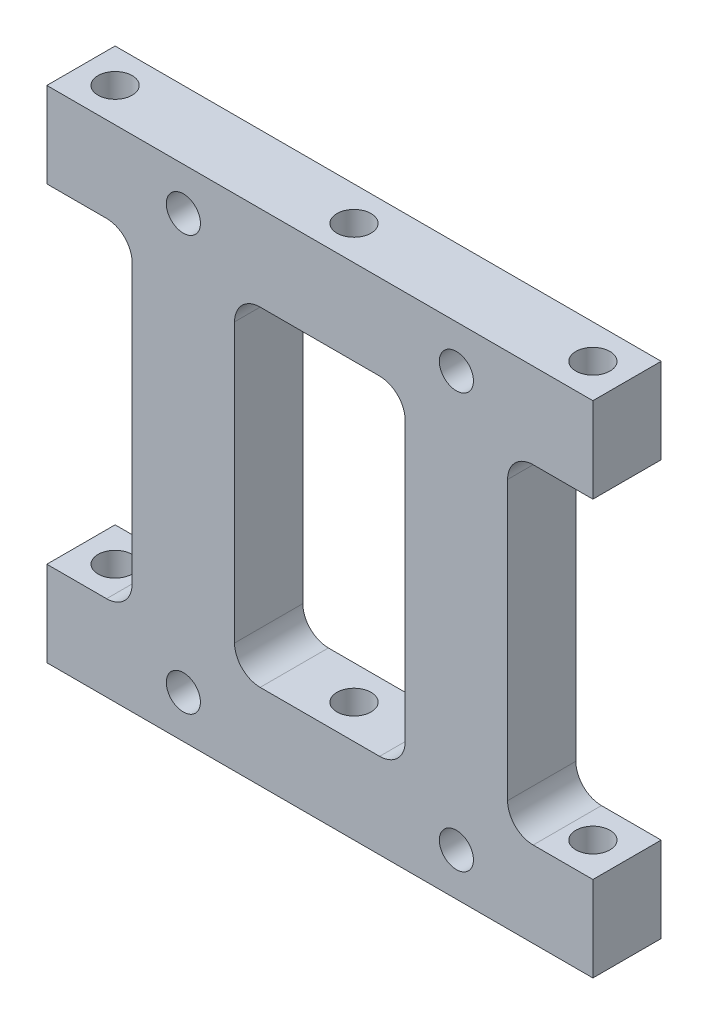
ISO-10303-21;
HEADER;
FILE_DESCRIPTION(('STEP AP214'),'2;1');
FILE_NAME('part.step','',(''),(''),'','','');
FILE_SCHEMA(('AUTOMOTIVE_DESIGN { 1 0 10303 214 1 1 1 1 }'));
ENDSEC;
DATA;
#1=APPLICATION_CONTEXT('core data for automotive mechanical design processes');
#2=APPLICATION_PROTOCOL_DEFINITION('international standard','automotive_design',2000,#1);
#3=PRODUCT_CONTEXT('',#1,'mechanical');
#4=PRODUCT('Part','Part','',(#3));
#5=PRODUCT_RELATED_PRODUCT_CATEGORY('part','',(#4));
#6=PRODUCT_DEFINITION_FORMATION('','',#4);
#7=PRODUCT_DEFINITION_CONTEXT('part definition',#1,'design');
#8=PRODUCT_DEFINITION('design','',#6,#7);
#9=PRODUCT_DEFINITION_SHAPE('','',#8);
#10=(LENGTH_UNIT() NAMED_UNIT(*) SI_UNIT(.MILLI.,.METRE.));
#11=(NAMED_UNIT(*) PLANE_ANGLE_UNIT() SI_UNIT($,.RADIAN.));
#12=(NAMED_UNIT(*) SI_UNIT($,.STERADIAN.) SOLID_ANGLE_UNIT());
#13=UNCERTAINTY_MEASURE_WITH_UNIT(LENGTH_MEASURE(1.E-05),#10,'distance_accuracy_value','');
#14=(GEOMETRIC_REPRESENTATION_CONTEXT(3) GLOBAL_UNCERTAINTY_ASSIGNED_CONTEXT((#13)) GLOBAL_UNIT_ASSIGNED_CONTEXT((#10,
#11,#12)) REPRESENTATION_CONTEXT('',''));
#15=CARTESIAN_POINT('',(0.,0.,0.));
#16=DIRECTION('',(0.,0.,1.));
#17=DIRECTION('',(1.,0.,0.));
#18=AXIS2_PLACEMENT_3D('',#15,#16,#17);
#19=CARTESIAN_POINT('',(0.,0.,8.));
#20=DIRECTION('',(1.,0.,0.));
#21=DIRECTION('',(0.,0.,-1.));
#22=AXIS2_PLACEMENT_3D('',#19,#20,#21);
#23=PLANE('',#22);
#24=DIRECTION('',(0.,-1.,0.));
#25=VECTOR('',#24,1.);
#26=CARTESIAN_POINT('',(0.,0.,0.));
#27=LINE('',#26,#25);
#28=CARTESIAN_POINT('',(0.,10.,0.));
#29=VERTEX_POINT('',#28);
#30=CARTESIAN_POINT('',(0.,0.,0.));
#31=VERTEX_POINT('',#30);
#32=EDGE_CURVE('E283',#29,#31,#27,.T.);
#33=ORIENTED_EDGE('',*,*,#32,.T.);
#34=DIRECTION('',(0.,0.,-1.));
#35=VECTOR('',#34,1.);
#36=CARTESIAN_POINT('',(0.,0.,8.));
#37=LINE('',#36,#35);
#38=CARTESIAN_POINT('',(0.,0.,8.));
#39=VERTEX_POINT('',#38);
#40=EDGE_CURVE('E338',#39,#31,#37,.T.);
#41=ORIENTED_EDGE('',*,*,#40,.F.);
#42=DIRECTION('',(0.,-1.,0.));
#43=VECTOR('',#42,1.);
#44=CARTESIAN_POINT('',(0.,0.,8.));
#45=LINE('',#44,#43);
#46=CARTESIAN_POINT('',(0.,10.,8.));
#47=VERTEX_POINT('',#46);
#48=EDGE_CURVE('E284',#47,#39,#45,.T.);
#49=ORIENTED_EDGE('',*,*,#48,.F.);
#50=DIRECTION('',(0.,0.,-1.));
#51=VECTOR('',#50,1.);
#52=CARTESIAN_POINT('',(0.,10.,8.));
#53=LINE('',#52,#51);
#54=EDGE_CURVE('E307',#47,#29,#53,.T.);
#55=ORIENTED_EDGE('',*,*,#54,.T.);
#56=EDGE_LOOP('',(#33,#41,#49,#55));
#57=FACE_BOUND('',#56,.T.);
#58=ADVANCED_FACE('F38',(#57),#23,.F.);
#59=CARTESIAN_POINT('',(0.,0.,8.));
#60=DIRECTION('',(0.,1.,0.));
#61=DIRECTION('',(0.,0.,1.));
#62=AXIS2_PLACEMENT_3D('',#59,#60,#61);
#63=PLANE('',#62);
#64=CARTESIAN_POINT('',(32.,0.,4.));
#65=DIRECTION('',(0.,-1.,0.));
#66=DIRECTION('',(0.,0.,-1.));
#67=AXIS2_PLACEMENT_3D('',#64,#65,#66);
#68=CIRCLE('',#67,2.);
#69=CARTESIAN_POINT('',(32.,0.,2.));
#70=VERTEX_POINT('',#69);
#71=EDGE_CURVE('E653',#70,#70,#68,.T.);
#72=ORIENTED_EDGE('',*,*,#71,.F.);
#73=EDGE_LOOP('',(#72));
#74=FACE_BOUND('',#73,.T.);
#75=CARTESIAN_POINT('',(60.,0.,4.));
#76=DIRECTION('',(0.,1.,0.));
#77=DIRECTION('',(0.,0.,1.));
#78=AXIS2_PLACEMENT_3D('',#75,#76,#77);
#79=CIRCLE('',#78,2.);
#80=CARTESIAN_POINT('',(60.,0.,6.));
#81=VERTEX_POINT('',#80);
#82=EDGE_CURVE('E235',#81,#81,#79,.F.);
#83=ORIENTED_EDGE('',*,*,#82,.F.);
#84=EDGE_LOOP('',(#83));
#85=FACE_BOUND('',#84,.T.);
#86=CARTESIAN_POINT('',(4.,0.,4.));
#87=DIRECTION('',(0.,1.,0.));
#88=DIRECTION('',(0.,0.,1.));
#89=AXIS2_PLACEMENT_3D('',#86,#87,#88);
#90=CIRCLE('',#89,2.);
#91=CARTESIAN_POINT('',(4.,0.,6.));
#92=VERTEX_POINT('',#91);
#93=EDGE_CURVE('E280',#92,#92,#90,.T.);
#94=ORIENTED_EDGE('',*,*,#93,.T.);
#95=EDGE_LOOP('',(#94));
#96=FACE_BOUND('',#95,.T.);
#97=DIRECTION('',(1.,0.,0.));
#98=VECTOR('',#97,1.);
#99=CARTESIAN_POINT('',(0.,0.,0.));
#100=LINE('',#99,#98);
#101=CARTESIAN_POINT('',(64.,0.,0.));
#102=VERTEX_POINT('',#101);
#103=EDGE_CURVE('E310',#31,#102,#100,.T.);
#104=ORIENTED_EDGE('',*,*,#103,.T.);
#105=DIRECTION('',(0.,0.,-1.));
#106=VECTOR('',#105,1.);
#107=CARTESIAN_POINT('',(64.,0.,8.));
#108=LINE('',#107,#106);
#109=CARTESIAN_POINT('',(64.,0.,8.));
#110=VERTEX_POINT('',#109);
#111=EDGE_CURVE('E249',#110,#102,#108,.T.);
#112=ORIENTED_EDGE('',*,*,#111,.F.);
#113=DIRECTION('',(1.,0.,0.));
#114=VECTOR('',#113,1.);
#115=CARTESIAN_POINT('',(0.,0.,8.));
#116=LINE('',#115,#114);
#117=EDGE_CURVE('E228',#39,#110,#116,.T.);
#118=ORIENTED_EDGE('',*,*,#117,.F.);
#119=ORIENTED_EDGE('',*,*,#40,.T.);
#120=EDGE_LOOP('',(#104,#112,#118,#119));
#121=FACE_BOUND('',#120,.T.);
#122=ADVANCED_FACE('F443',(#74,#85,#96,#121),#63,.F.);
#123=CARTESIAN_POINT('',(22.,10.,8.));
#124=DIRECTION('',(0.,-1.,0.));
#125=DIRECTION('',(0.,0.,-1.));
#126=AXIS2_PLACEMENT_3D('',#123,#124,#125);
#127=PLANE('',#126);
#128=CARTESIAN_POINT('',(32.,9.99999999999999,4.));
#129=DIRECTION('',(0.,-1.,0.));
#130=DIRECTION('',(0.,0.,-1.));
#131=AXIS2_PLACEMENT_3D('',#128,#129,#130);
#132=CIRCLE('',#131,2.);
#133=CARTESIAN_POINT('',(32.,9.99999999999999,2.));
#134=VERTEX_POINT('',#133);
#135=EDGE_CURVE('E621',#134,#134,#132,.T.);
#136=ORIENTED_EDGE('',*,*,#135,.T.);
#137=EDGE_LOOP('',(#136));
#138=FACE_BOUND('',#137,.T.);
#139=DIRECTION('',(-1.,0.,0.));
#140=VECTOR('',#139,1.);
#141=CARTESIAN_POINT('',(22.,10.,8.));
#142=LINE('',#141,#140);
#143=CARTESIAN_POINT('',(39.,10.,8.));
#144=VERTEX_POINT('',#143);
#145=CARTESIAN_POINT('',(25.,10.,8.));
#146=VERTEX_POINT('',#145);
#147=EDGE_CURVE('E288',#144,#146,#142,.T.);
#148=ORIENTED_EDGE('',*,*,#147,.F.);
#149=DIRECTION('',(0.,0.,-1.));
#150=VECTOR('',#149,1.);
#151=CARTESIAN_POINT('',(39.,10.,8.));
#152=LINE('',#151,#150);
#153=CARTESIAN_POINT('',(39.,10.,0.));
#154=VERTEX_POINT('',#153);
#155=EDGE_CURVE('E394',#144,#154,#152,.T.);
#156=ORIENTED_EDGE('',*,*,#155,.T.);
#157=DIRECTION('',(-1.,0.,0.));
#158=VECTOR('',#157,1.);
#159=CARTESIAN_POINT('',(22.,10.,0.));
#160=LINE('',#159,#158);
#161=CARTESIAN_POINT('',(25.,10.,0.));
#162=VERTEX_POINT('',#161);
#163=EDGE_CURVE('E312',#154,#162,#160,.T.);
#164=ORIENTED_EDGE('',*,*,#163,.T.);
#165=DIRECTION('',(0.,0.,-1.));
#166=VECTOR('',#165,1.);
#167=CARTESIAN_POINT('',(25.,10.,8.));
#168=LINE('',#167,#166);
#169=EDGE_CURVE('E356',#162,#146,#168,.F.);
#170=ORIENTED_EDGE('',*,*,#169,.T.);
#171=EDGE_LOOP('',(#148,#156,#164,#170));
#172=FACE_BOUND('',#171,.T.);
#173=ADVANCED_FACE('F446',(#138,#172),#127,.F.);
#174=CARTESIAN_POINT('',(22.,48.6,8.));
#175=DIRECTION('',(-1.,0.,0.));
#176=DIRECTION('',(0.,-1.,0.));
#177=AXIS2_PLACEMENT_3D('',#174,#175,#176);
#178=PLANE('',#177);
#179=DIRECTION('',(0.,1.,0.));
#180=VECTOR('',#179,1.);
#181=CARTESIAN_POINT('',(22.,48.6,8.));
#182=LINE('',#181,#180);
#183=CARTESIAN_POINT('',(22.,13.,8.));
#184=VERTEX_POINT('',#183);
#185=CARTESIAN_POINT('',(22.,45.6,8.));
#186=VERTEX_POINT('',#185);
#187=EDGE_CURVE('E290',#184,#186,#182,.T.);
#188=ORIENTED_EDGE('',*,*,#187,.F.);
#189=DIRECTION('',(0.,0.,-1.));
#190=VECTOR('',#189,1.);
#191=CARTESIAN_POINT('',(22.,13.,0.));
#192=LINE('',#191,#190);
#193=CARTESIAN_POINT('',(22.,13.,0.));
#194=VERTEX_POINT('',#193);
#195=EDGE_CURVE('E353',#184,#194,#192,.T.);
#196=ORIENTED_EDGE('',*,*,#195,.T.);
#197=DIRECTION('',(0.,1.,0.));
#198=VECTOR('',#197,1.);
#199=CARTESIAN_POINT('',(22.,48.6,0.));
#200=LINE('',#199,#198);
#201=CARTESIAN_POINT('',(22.,45.6,0.));
#202=VERTEX_POINT('',#201);
#203=EDGE_CURVE('E314',#194,#202,#200,.T.);
#204=ORIENTED_EDGE('',*,*,#203,.T.);
#205=DIRECTION('',(0.,0.,-1.));
#206=VECTOR('',#205,1.);
#207=CARTESIAN_POINT('',(22.,45.6,8.));
#208=LINE('',#207,#206);
#209=EDGE_CURVE('E351',#202,#186,#208,.F.);
#210=ORIENTED_EDGE('',*,*,#209,.T.);
#211=EDGE_LOOP('',(#188,#196,#204,#210));
#212=FACE_BOUND('',#211,.T.);
#213=ADVANCED_FACE('F554',(#212),#178,.F.);
#214=CARTESIAN_POINT('',(22.,48.6,8.));
#215=DIRECTION('',(0.,1.,0.));
#216=DIRECTION('',(0.,0.,1.));
#217=AXIS2_PLACEMENT_3D('',#214,#215,#216);
#218=PLANE('',#217);
#219=CARTESIAN_POINT('',(32.,48.6,4.));
#220=DIRECTION('',(0.,1.,0.));
#221=DIRECTION('',(0.,0.,1.));
#222=AXIS2_PLACEMENT_3D('',#219,#220,#221);
#223=CIRCLE('',#222,2.);
#224=CARTESIAN_POINT('',(32.,48.6,6.00000000000001));
#225=VERTEX_POINT('',#224);
#226=EDGE_CURVE('E623',#225,#225,#223,.T.);
#227=ORIENTED_EDGE('',*,*,#226,.T.);
#228=EDGE_LOOP('',(#227));
#229=FACE_BOUND('',#228,.T.);
#230=DIRECTION('',(1.,0.,0.));
#231=VECTOR('',#230,1.);
#232=CARTESIAN_POINT('',(22.,48.6,0.));
#233=LINE('',#232,#231);
#234=CARTESIAN_POINT('',(25.,48.6,0.));
#235=VERTEX_POINT('',#234);
#236=CARTESIAN_POINT('',(39.,48.6,0.));
#237=VERTEX_POINT('',#236);
#238=EDGE_CURVE('E317',#235,#237,#233,.T.);
#239=ORIENTED_EDGE('',*,*,#238,.T.);
#240=DIRECTION('',(0.,0.,-1.));
#241=VECTOR('',#240,1.);
#242=CARTESIAN_POINT('',(39.,48.6,8.));
#243=LINE('',#242,#241);
#244=CARTESIAN_POINT('',(39.,48.6,8.));
#245=VERTEX_POINT('',#244);
#246=EDGE_CURVE('E61',#237,#245,#243,.F.);
#247=ORIENTED_EDGE('',*,*,#246,.T.);
#248=DIRECTION('',(1.,0.,0.));
#249=VECTOR('',#248,1.);
#250=CARTESIAN_POINT('',(22.,48.6,8.));
#251=LINE('',#250,#249);
#252=CARTESIAN_POINT('',(25.,48.6,8.));
#253=VERTEX_POINT('',#252);
#254=EDGE_CURVE('E293',#253,#245,#251,.T.);
#255=ORIENTED_EDGE('',*,*,#254,.F.);
#256=DIRECTION('',(0.,0.,-1.));
#257=VECTOR('',#256,1.);
#258=CARTESIAN_POINT('',(25.,48.6,0.));
#259=LINE('',#258,#257);
#260=EDGE_CURVE('E359',#253,#235,#259,.T.);
#261=ORIENTED_EDGE('',*,*,#260,.T.);
#262=EDGE_LOOP('',(#239,#247,#255,#261));
#263=FACE_BOUND('',#262,.T.);
#264=ADVANCED_FACE('F559',(#229,#263),#218,.F.);
#265=CARTESIAN_POINT('',(0.,58.6,8.));
#266=DIRECTION('',(0.,-1.,0.));
#267=DIRECTION('',(0.,0.,-1.));
#268=AXIS2_PLACEMENT_3D('',#265,#266,#267);
#269=PLANE('',#268);
#270=CARTESIAN_POINT('',(32.,58.6,4.));
#271=DIRECTION('',(0.,-1.,0.));
#272=DIRECTION('',(0.,0.,-1.));
#273=AXIS2_PLACEMENT_3D('',#270,#271,#272);
#274=CIRCLE('',#273,2.);
#275=CARTESIAN_POINT('',(32.,58.6,2.));
#276=VERTEX_POINT('',#275);
#277=EDGE_CURVE('E42',#276,#276,#274,.T.);
#278=ORIENTED_EDGE('',*,*,#277,.T.);
#279=EDGE_LOOP('',(#278));
#280=FACE_BOUND('',#279,.T.);
#281=CARTESIAN_POINT('',(60.,58.6,4.));
#282=DIRECTION('',(0.,-1.,0.));
#283=DIRECTION('',(0.,0.,1.));
#284=AXIS2_PLACEMENT_3D('',#281,#282,#283);
#285=CIRCLE('',#284,2.);
#286=CARTESIAN_POINT('',(60.,58.6,6.));
#287=VERTEX_POINT('',#286);
#288=EDGE_CURVE('E420',#287,#287,#285,.T.);
#289=ORIENTED_EDGE('',*,*,#288,.T.);
#290=EDGE_LOOP('',(#289));
#291=FACE_BOUND('',#290,.T.);
#292=CARTESIAN_POINT('',(4.,58.6,4.));
#293=DIRECTION('',(0.,1.,0.));
#294=DIRECTION('',(0.,0.,1.));
#295=AXIS2_PLACEMENT_3D('',#292,#293,#294);
#296=CIRCLE('',#295,2.);
#297=CARTESIAN_POINT('',(4.,58.6,6.));
#298=VERTEX_POINT('',#297);
#299=EDGE_CURVE('E272',#298,#298,#296,.T.);
#300=ORIENTED_EDGE('',*,*,#299,.F.);
#301=EDGE_LOOP('',(#300));
#302=FACE_BOUND('',#301,.T.);
#303=DIRECTION('',(-1.,0.,0.));
#304=VECTOR('',#303,1.);
#305=CARTESIAN_POINT('',(0.,58.6,0.));
#306=LINE('',#305,#304);
#307=CARTESIAN_POINT('',(64.,58.6,0.));
#308=VERTEX_POINT('',#307);
#309=CARTESIAN_POINT('',(0.,58.6,0.));
#310=VERTEX_POINT('',#309);
#311=EDGE_CURVE('E319',#308,#310,#306,.T.);
#312=ORIENTED_EDGE('',*,*,#311,.T.);
#313=DIRECTION('',(0.,0.,-1.));
#314=VECTOR('',#313,1.);
#315=CARTESIAN_POINT('',(0.,58.6,8.));
#316=LINE('',#315,#314);
#317=CARTESIAN_POINT('',(0.,58.6,8.));
#318=VERTEX_POINT('',#317);
#319=EDGE_CURVE('E335',#318,#310,#316,.T.);
#320=ORIENTED_EDGE('',*,*,#319,.F.);
#321=DIRECTION('',(-1.,0.,0.));
#322=VECTOR('',#321,1.);
#323=CARTESIAN_POINT('',(0.,58.6,8.));
#324=LINE('',#323,#322);
#325=CARTESIAN_POINT('',(64.,58.6,8.));
#326=VERTEX_POINT('',#325);
#327=EDGE_CURVE('E295',#326,#318,#324,.T.);
#328=ORIENTED_EDGE('',*,*,#327,.F.);
#329=DIRECTION('',(0.,0.,-1.));
#330=VECTOR('',#329,1.);
#331=CARTESIAN_POINT('',(64.,58.6,8.));
#332=LINE('',#331,#330);
#333=EDGE_CURVE('E262',#326,#308,#332,.T.);
#334=ORIENTED_EDGE('',*,*,#333,.T.);
#335=EDGE_LOOP('',(#312,#320,#328,#334));
#336=FACE_BOUND('',#335,.T.);
#337=ADVANCED_FACE('F480',(#280,#291,#302,#336),#269,.F.);
#338=CARTESIAN_POINT('',(0.,58.6,8.));
#339=DIRECTION('',(1.,0.,0.));
#340=DIRECTION('',(0.,0.,-1.));
#341=AXIS2_PLACEMENT_3D('',#338,#339,#340);
#342=PLANE('',#341);
#343=DIRECTION('',(0.,-1.,0.));
#344=VECTOR('',#343,1.);
#345=CARTESIAN_POINT('',(0.,58.6,0.));
#346=LINE('',#345,#344);
#347=CARTESIAN_POINT('',(0.,48.6,0.));
#348=VERTEX_POINT('',#347);
#349=EDGE_CURVE('E321',#310,#348,#346,.T.);
#350=ORIENTED_EDGE('',*,*,#349,.T.);
#351=DIRECTION('',(0.,0.,-1.));
#352=VECTOR('',#351,1.);
#353=CARTESIAN_POINT('',(0.,48.6,8.));
#354=LINE('',#353,#352);
#355=CARTESIAN_POINT('',(0.,48.6,8.));
#356=VERTEX_POINT('',#355);
#357=EDGE_CURVE('E332',#356,#348,#354,.T.);
#358=ORIENTED_EDGE('',*,*,#357,.F.);
#359=DIRECTION('',(0.,-1.,0.));
#360=VECTOR('',#359,1.);
#361=CARTESIAN_POINT('',(0.,58.6,8.));
#362=LINE('',#361,#360);
#363=EDGE_CURVE('E297',#318,#356,#362,.T.);
#364=ORIENTED_EDGE('',*,*,#363,.F.);
#365=ORIENTED_EDGE('',*,*,#319,.T.);
#366=EDGE_LOOP('',(#350,#358,#364,#365));
#367=FACE_BOUND('',#366,.T.);
#368=ADVANCED_FACE('F483',(#367),#342,.F.);
#369=CARTESIAN_POINT('',(0.,48.6,8.));
#370=DIRECTION('',(0.,1.,0.));
#371=DIRECTION('',(0.,0.,1.));
#372=AXIS2_PLACEMENT_3D('',#369,#370,#371);
#373=PLANE('',#372);
#374=CARTESIAN_POINT('',(4.,48.6,4.));
#375=DIRECTION('',(0.,1.,0.));
#376=DIRECTION('',(0.,0.,1.));
#377=AXIS2_PLACEMENT_3D('',#374,#375,#376);
#378=CIRCLE('',#377,2.);
#379=CARTESIAN_POINT('',(4.,48.6,6.));
#380=VERTEX_POINT('',#379);
#381=EDGE_CURVE('E277',#380,#380,#378,.T.);
#382=ORIENTED_EDGE('',*,*,#381,.T.);
#383=EDGE_LOOP('',(#382));
#384=FACE_BOUND('',#383,.T.);
#385=DIRECTION('',(1.,0.,0.));
#386=VECTOR('',#385,1.);
#387=CARTESIAN_POINT('',(0.,48.6,0.));
#388=LINE('',#387,#386);
#389=CARTESIAN_POINT('',(7.,48.6,0.));
#390=VERTEX_POINT('',#389);
#391=EDGE_CURVE('E323',#348,#390,#388,.T.);
#392=ORIENTED_EDGE('',*,*,#391,.T.);
#393=DIRECTION('',(0.,0.,-1.));
#394=VECTOR('',#393,1.);
#395=CARTESIAN_POINT('',(7.,48.6,8.));
#396=LINE('',#395,#394);
#397=CARTESIAN_POINT('',(7.,48.6,8.));
#398=VERTEX_POINT('',#397);
#399=EDGE_CURVE('E346',#390,#398,#396,.F.);
#400=ORIENTED_EDGE('',*,*,#399,.T.);
#401=DIRECTION('',(1.,0.,0.));
#402=VECTOR('',#401,1.);
#403=CARTESIAN_POINT('',(0.,48.6,8.));
#404=LINE('',#403,#402);
#405=EDGE_CURVE('E299',#356,#398,#404,.T.);
#406=ORIENTED_EDGE('',*,*,#405,.F.);
#407=ORIENTED_EDGE('',*,*,#357,.T.);
#408=EDGE_LOOP('',(#392,#400,#406,#407));
#409=FACE_BOUND('',#408,.T.);
#410=ADVANCED_FACE('F487',(#384,#409),#373,.F.);
#411=CARTESIAN_POINT('',(10.,48.6,8.));
#412=DIRECTION('',(1.,0.,0.));
#413=DIRECTION('',(0.,1.,0.));
#414=AXIS2_PLACEMENT_3D('',#411,#412,#413);
#415=PLANE('',#414);
#416=DIRECTION('',(0.,-1.,0.));
#417=VECTOR('',#416,1.);
#418=CARTESIAN_POINT('',(10.,48.6,8.));
#419=LINE('',#418,#417);
#420=CARTESIAN_POINT('',(10.,45.6,8.));
#421=VERTEX_POINT('',#420);
#422=CARTESIAN_POINT('',(10.,13.,8.));
#423=VERTEX_POINT('',#422);
#424=EDGE_CURVE('E302',#421,#423,#419,.T.);
#425=ORIENTED_EDGE('',*,*,#424,.F.);
#426=DIRECTION('',(0.,0.,-1.));
#427=VECTOR('',#426,1.);
#428=CARTESIAN_POINT('',(10.,45.6,0.));
#429=LINE('',#428,#427);
#430=CARTESIAN_POINT('',(10.,45.6,0.));
#431=VERTEX_POINT('',#430);
#432=EDGE_CURVE('E343',#421,#431,#429,.T.);
#433=ORIENTED_EDGE('',*,*,#432,.T.);
#434=DIRECTION('',(0.,-1.,0.));
#435=VECTOR('',#434,1.);
#436=CARTESIAN_POINT('',(10.,48.6,0.));
#437=LINE('',#436,#435);
#438=CARTESIAN_POINT('',(10.,13.,0.));
#439=VERTEX_POINT('',#438);
#440=EDGE_CURVE('E326',#431,#439,#437,.T.);
#441=ORIENTED_EDGE('',*,*,#440,.T.);
#442=DIRECTION('',(0.,0.,-1.));
#443=VECTOR('',#442,1.);
#444=CARTESIAN_POINT('',(10.,13.,8.));
#445=LINE('',#444,#443);
#446=EDGE_CURVE('E341',#439,#423,#445,.F.);
#447=ORIENTED_EDGE('',*,*,#446,.T.);
#448=EDGE_LOOP('',(#425,#433,#441,#447));
#449=FACE_BOUND('',#448,.T.);
#450=ADVANCED_FACE('F496',(#449),#415,.F.);
#451=CARTESIAN_POINT('',(0.,10.,8.));
#452=DIRECTION('',(0.,-1.,0.));
#453=DIRECTION('',(0.,0.,-1.));
#454=AXIS2_PLACEMENT_3D('',#451,#452,#453);
#455=PLANE('',#454);
#456=CARTESIAN_POINT('',(4.,10.,4.));
#457=DIRECTION('',(0.,-1.,0.));
#458=DIRECTION('',(0.,0.,-1.));
#459=AXIS2_PLACEMENT_3D('',#456,#457,#458);
#460=CIRCLE('',#459,2.);
#461=CARTESIAN_POINT('',(4.,10.,2.));
#462=VERTEX_POINT('',#461);
#463=EDGE_CURVE('E275',#462,#462,#460,.T.);
#464=ORIENTED_EDGE('',*,*,#463,.T.);
#465=EDGE_LOOP('',(#464));
#466=FACE_BOUND('',#465,.T.);
#467=DIRECTION('',(-1.,0.,0.));
#468=VECTOR('',#467,1.);
#469=CARTESIAN_POINT('',(0.,10.,8.));
#470=LINE('',#469,#468);
#471=CARTESIAN_POINT('',(7.,10.,8.));
#472=VERTEX_POINT('',#471);
#473=EDGE_CURVE('E305',#472,#47,#470,.T.);
#474=ORIENTED_EDGE('',*,*,#473,.F.);
#475=DIRECTION('',(0.,0.,-1.));
#476=VECTOR('',#475,1.);
#477=CARTESIAN_POINT('',(7.,10.,0.));
#478=LINE('',#477,#476);
#479=CARTESIAN_POINT('',(7.,10.,0.));
#480=VERTEX_POINT('',#479);
#481=EDGE_CURVE('E348',#472,#480,#478,.T.);
#482=ORIENTED_EDGE('',*,*,#481,.T.);
#483=DIRECTION('',(-1.,0.,0.));
#484=VECTOR('',#483,1.);
#485=CARTESIAN_POINT('',(0.,10.,0.));
#486=LINE('',#485,#484);
#487=EDGE_CURVE('E286',#480,#29,#486,.T.);
#488=ORIENTED_EDGE('',*,*,#487,.T.);
#489=ORIENTED_EDGE('',*,*,#54,.F.);
#490=EDGE_LOOP('',(#474,#482,#488,#489));
#491=FACE_BOUND('',#490,.T.);
#492=ADVANCED_FACE('F505',(#466,#491),#455,.F.);
#493=CARTESIAN_POINT('',(0.,0.,8.));
#494=DIRECTION('',(0.,0.,-1.));
#495=DIRECTION('',(-1.,0.,0.));
#496=AXIS2_PLACEMENT_3D('',#493,#494,#495);
#497=PLANE('',#496);
#498=CARTESIAN_POINT('',(48.,53.6,8.));
#499=DIRECTION('',(0.,0.,-1.));
#500=DIRECTION('',(-1.,0.,0.));
#501=AXIS2_PLACEMENT_3D('',#498,#499,#500);
#502=CIRCLE('',#501,2.);
#503=CARTESIAN_POINT('',(46.,53.6,8.));
#504=VERTEX_POINT('',#503);
#505=EDGE_CURVE('E424',#504,#504,#502,.T.);
#506=ORIENTED_EDGE('',*,*,#505,.T.);
#507=EDGE_LOOP('',(#506));
#508=FACE_BOUND('',#507,.T.);
#509=CARTESIAN_POINT('',(48.,5.,8.));
#510=DIRECTION('',(0.,0.,-1.));
#511=DIRECTION('',(1.,0.,0.));
#512=AXIS2_PLACEMENT_3D('',#509,#510,#511);
#513=CIRCLE('',#512,2.);
#514=CARTESIAN_POINT('',(50.,5.,8.));
#515=VERTEX_POINT('',#514);
#516=EDGE_CURVE('E433',#515,#515,#513,.T.);
#517=ORIENTED_EDGE('',*,*,#516,.T.);
#518=EDGE_LOOP('',(#517));
#519=FACE_BOUND('',#518,.T.);
#520=DIRECTION('',(0.,-1.,0.));
#521=VECTOR('',#520,1.);
#522=CARTESIAN_POINT('',(64.,58.6,8.));
#523=LINE('',#522,#521);
#524=CARTESIAN_POINT('',(64.,48.6,8.));
#525=VERTEX_POINT('',#524);
#526=EDGE_CURVE('E243',#326,#525,#523,.T.);
#527=ORIENTED_EDGE('',*,*,#526,.F.);
#528=ORIENTED_EDGE('',*,*,#327,.T.);
#529=ORIENTED_EDGE('',*,*,#363,.T.);
#530=ORIENTED_EDGE('',*,*,#405,.T.);
#531=CARTESIAN_POINT('',(7.,45.6,8.));
#532=DIRECTION('',(0.,0.,-1.));
#533=DIRECTION('',(-1.,0.,0.));
#534=AXIS2_PLACEMENT_3D('',#531,#532,#533);
#535=CIRCLE('',#534,3.);
#536=EDGE_CURVE('E364',#398,#421,#535,.T.);
#537=ORIENTED_EDGE('',*,*,#536,.T.);
#538=ORIENTED_EDGE('',*,*,#424,.T.);
#539=CARTESIAN_POINT('',(7.,13.,8.));
#540=DIRECTION('',(0.,0.,-1.));
#541=DIRECTION('',(-1.,0.,0.));
#542=AXIS2_PLACEMENT_3D('',#539,#540,#541);
#543=CIRCLE('',#542,3.);
#544=EDGE_CURVE('E368',#423,#472,#543,.T.);
#545=ORIENTED_EDGE('',*,*,#544,.T.);
#546=ORIENTED_EDGE('',*,*,#473,.T.);
#547=ORIENTED_EDGE('',*,*,#48,.T.);
#548=ORIENTED_EDGE('',*,*,#117,.T.);
#549=DIRECTION('',(0.,-1.,0.));
#550=VECTOR('',#549,1.);
#551=CARTESIAN_POINT('',(64.,0.,8.));
#552=LINE('',#551,#550);
#553=CARTESIAN_POINT('',(64.,10.,8.));
#554=VERTEX_POINT('',#553);
#555=EDGE_CURVE('E213',#554,#110,#552,.T.);
#556=ORIENTED_EDGE('',*,*,#555,.F.);
#557=DIRECTION('',(1.,0.,0.));
#558=VECTOR('',#557,1.);
#559=CARTESIAN_POINT('',(64.,10.,8.));
#560=LINE('',#559,#558);
#561=CARTESIAN_POINT('',(57.,10.,8.));
#562=VERTEX_POINT('',#561);
#563=EDGE_CURVE('E201',#562,#554,#560,.T.);
#564=ORIENTED_EDGE('',*,*,#563,.F.);
#565=CARTESIAN_POINT('',(57.,13.,8.));
#566=DIRECTION('',(0.,0.,-1.));
#567=DIRECTION('',(-1.,0.,0.));
#568=AXIS2_PLACEMENT_3D('',#565,#566,#567);
#569=CIRCLE('',#568,3.);
#570=CARTESIAN_POINT('',(54.,13.,8.));
#571=VERTEX_POINT('',#570);
#572=EDGE_CURVE('E409',#562,#571,#569,.T.);
#573=ORIENTED_EDGE('',*,*,#572,.T.);
#574=DIRECTION('',(0.,-1.,0.));
#575=VECTOR('',#574,1.);
#576=CARTESIAN_POINT('',(54.,48.6,8.));
#577=LINE('',#576,#575);
#578=CARTESIAN_POINT('',(54.,45.6,8.));
#579=VERTEX_POINT('',#578);
#580=EDGE_CURVE('E212',#579,#571,#577,.T.);
#581=ORIENTED_EDGE('',*,*,#580,.F.);
#582=CARTESIAN_POINT('',(57.,45.6,8.));
#583=DIRECTION('',(0.,0.,-1.));
#584=DIRECTION('',(-1.,0.,0.));
#585=AXIS2_PLACEMENT_3D('',#582,#583,#584);
#586=CIRCLE('',#585,3.);
#587=CARTESIAN_POINT('',(57.,48.6,8.));
#588=VERTEX_POINT('',#587);
#589=EDGE_CURVE('E405',#579,#588,#586,.T.);
#590=ORIENTED_EDGE('',*,*,#589,.T.);
#591=DIRECTION('',(-1.,0.,0.));
#592=VECTOR('',#591,1.);
#593=CARTESIAN_POINT('',(64.,48.6,8.));
#594=LINE('',#593,#592);
#595=EDGE_CURVE('E240',#525,#588,#594,.T.);
#596=ORIENTED_EDGE('',*,*,#595,.F.);
#597=EDGE_LOOP('',(#527,#528,#529,#530,#537,#538,#545,#546,#547,#548,#556,#564,#573,#581,#590,#596));
#598=FACE_BOUND('',#597,.T.);
#599=CARTESIAN_POINT('',(16.,53.6,8.));
#600=DIRECTION('',(0.,0.,1.));
#601=DIRECTION('',(1.,0.,0.));
#602=AXIS2_PLACEMENT_3D('',#599,#600,#601);
#603=CIRCLE('',#602,2.);
#604=CARTESIAN_POINT('',(18.,53.6,8.));
#605=VERTEX_POINT('',#604);
#606=EDGE_CURVE('E266',#605,#605,#603,.T.);
#607=ORIENTED_EDGE('',*,*,#606,.F.);
#608=EDGE_LOOP('',(#607));
#609=FACE_BOUND('',#608,.T.);
#610=CARTESIAN_POINT('',(16.,5.,8.));
#611=DIRECTION('',(0.,0.,1.));
#612=DIRECTION('',(-1.,0.,0.));
#613=AXIS2_PLACEMENT_3D('',#610,#611,#612);
#614=CIRCLE('',#613,2.);
#615=CARTESIAN_POINT('',(14.,5.,8.));
#616=VERTEX_POINT('',#615);
#617=EDGE_CURVE('E221',#616,#616,#614,.T.);
#618=ORIENTED_EDGE('',*,*,#617,.F.);
#619=EDGE_LOOP('',(#618));
#620=FACE_BOUND('',#619,.T.);
#621=ORIENTED_EDGE('',*,*,#254,.T.);
#622=CARTESIAN_POINT('',(39.,45.6,8.));
#623=DIRECTION('',(0.,0.,-1.));
#624=DIRECTION('',(-1.,0.,0.));
#625=AXIS2_PLACEMENT_3D('',#622,#623,#624);
#626=CIRCLE('',#625,3.);
#627=CARTESIAN_POINT('',(42.,45.6,8.));
#628=VERTEX_POINT('',#627);
#629=EDGE_CURVE('E11',#245,#628,#626,.T.);
#630=ORIENTED_EDGE('',*,*,#629,.T.);
#631=DIRECTION('',(0.,1.,0.));
#632=VECTOR('',#631,1.);
#633=CARTESIAN_POINT('',(42.,48.6,8.));
#634=LINE('',#633,#632);
#635=CARTESIAN_POINT('',(42.,13.,8.));
#636=VERTEX_POINT('',#635);
#637=EDGE_CURVE('E246',#636,#628,#634,.T.);
#638=ORIENTED_EDGE('',*,*,#637,.F.);
#639=CARTESIAN_POINT('',(39.,13.,8.));
#640=DIRECTION('',(0.,0.,-1.));
#641=DIRECTION('',(-1.,0.,0.));
#642=AXIS2_PLACEMENT_3D('',#639,#640,#641);
#643=CIRCLE('',#642,3.);
#644=EDGE_CURVE('E413',#636,#144,#643,.T.);
#645=ORIENTED_EDGE('',*,*,#644,.T.);
#646=ORIENTED_EDGE('',*,*,#147,.T.);
#647=CARTESIAN_POINT('',(25.,13.,8.));
#648=DIRECTION('',(0.,0.,-1.));
#649=DIRECTION('',(-1.,0.,0.));
#650=AXIS2_PLACEMENT_3D('',#647,#648,#649);
#651=CIRCLE('',#650,3.);
#652=EDGE_CURVE('E373',#146,#184,#651,.T.);
#653=ORIENTED_EDGE('',*,*,#652,.T.);
#654=ORIENTED_EDGE('',*,*,#187,.T.);
#655=CARTESIAN_POINT('',(25.,45.6,8.));
#656=DIRECTION('',(0.,0.,-1.));
#657=DIRECTION('',(-1.,0.,0.));
#658=AXIS2_PLACEMENT_3D('',#655,#656,#657);
#659=CIRCLE('',#658,3.);
#660=EDGE_CURVE('E377',#186,#253,#659,.T.);
#661=ORIENTED_EDGE('',*,*,#660,.T.);
#662=EDGE_LOOP('',(#621,#630,#638,#645,#646,#653,#654,#661));
#663=FACE_BOUND('',#662,.T.);
#664=ADVANCED_FACE('F225',(#508,#519,#598,#609,#620,#663),#497,.F.);
#665=CARTESIAN_POINT('',(0.,0.,0.));
#666=DIRECTION('',(0.,0.,-1.));
#667=DIRECTION('',(-1.,0.,0.));
#668=AXIS2_PLACEMENT_3D('',#665,#666,#667);
#669=PLANE('',#668);
#670=CARTESIAN_POINT('',(48.,53.6,0.));
#671=DIRECTION('',(0.,0.,-1.));
#672=DIRECTION('',(-1.,0.,0.));
#673=AXIS2_PLACEMENT_3D('',#670,#671,#672);
#674=CIRCLE('',#673,2.);
#675=CARTESIAN_POINT('',(46.,53.6,0.));
#676=VERTEX_POINT('',#675);
#677=EDGE_CURVE('E423',#676,#676,#674,.F.);
#678=ORIENTED_EDGE('',*,*,#677,.T.);
#679=EDGE_LOOP('',(#678));
#680=FACE_BOUND('',#679,.T.);
#681=CARTESIAN_POINT('',(48.,5.,0.));
#682=DIRECTION('',(0.,0.,-1.));
#683=DIRECTION('',(-1.,0.,0.));
#684=AXIS2_PLACEMENT_3D('',#681,#682,#683);
#685=CIRCLE('',#684,2.);
#686=CARTESIAN_POINT('',(46.,5.,0.));
#687=VERTEX_POINT('',#686);
#688=EDGE_CURVE('E421',#687,#687,#685,.F.);
#689=ORIENTED_EDGE('',*,*,#688,.T.);
#690=EDGE_LOOP('',(#689));
#691=FACE_BOUND('',#690,.T.);
#692=ORIENTED_EDGE('',*,*,#311,.F.);
#693=DIRECTION('',(0.,-1.,0.));
#694=VECTOR('',#693,1.);
#695=CARTESIAN_POINT('',(64.,58.6,0.));
#696=LINE('',#695,#694);
#697=CARTESIAN_POINT('',(64.,48.6,0.));
#698=VERTEX_POINT('',#697);
#699=EDGE_CURVE('E232',#308,#698,#696,.T.);
#700=ORIENTED_EDGE('',*,*,#699,.T.);
#701=DIRECTION('',(-1.,0.,0.));
#702=VECTOR('',#701,1.);
#703=CARTESIAN_POINT('',(64.,48.6,0.));
#704=LINE('',#703,#702);
#705=CARTESIAN_POINT('',(57.,48.6,0.));
#706=VERTEX_POINT('',#705);
#707=EDGE_CURVE('E256',#698,#706,#704,.T.);
#708=ORIENTED_EDGE('',*,*,#707,.T.);
#709=CARTESIAN_POINT('',(57.,45.6,0.));
#710=DIRECTION('',(0.,0.,-1.));
#711=DIRECTION('',(-1.,0.,0.));
#712=AXIS2_PLACEMENT_3D('',#709,#710,#711);
#713=CIRCLE('',#712,3.);
#714=CARTESIAN_POINT('',(54.,45.6,0.));
#715=VERTEX_POINT('',#714);
#716=EDGE_CURVE('E403',#706,#715,#713,.F.);
#717=ORIENTED_EDGE('',*,*,#716,.T.);
#718=DIRECTION('',(0.,-1.,0.));
#719=VECTOR('',#718,1.);
#720=CARTESIAN_POINT('',(54.,48.6,0.));
#721=LINE('',#720,#719);
#722=CARTESIAN_POINT('',(54.,13.,0.));
#723=VERTEX_POINT('',#722);
#724=EDGE_CURVE('E253',#715,#723,#721,.T.);
#725=ORIENTED_EDGE('',*,*,#724,.T.);
#726=CARTESIAN_POINT('',(57.,13.,0.));
#727=DIRECTION('',(0.,0.,-1.));
#728=DIRECTION('',(-1.,0.,0.));
#729=AXIS2_PLACEMENT_3D('',#726,#727,#728);
#730=CIRCLE('',#729,3.);
#731=CARTESIAN_POINT('',(57.,10.,0.));
#732=VERTEX_POINT('',#731);
#733=EDGE_CURVE('E407',#723,#732,#730,.F.);
#734=ORIENTED_EDGE('',*,*,#733,.T.);
#735=DIRECTION('',(1.,0.,0.));
#736=VECTOR('',#735,1.);
#737=CARTESIAN_POINT('',(64.,10.,0.));
#738=LINE('',#737,#736);
#739=CARTESIAN_POINT('',(64.,10.,0.));
#740=VERTEX_POINT('',#739);
#741=EDGE_CURVE('E251',#732,#740,#738,.T.);
#742=ORIENTED_EDGE('',*,*,#741,.T.);
#743=DIRECTION('',(0.,-1.,0.));
#744=VECTOR('',#743,1.);
#745=CARTESIAN_POINT('',(64.,0.,0.));
#746=LINE('',#745,#744);
#747=EDGE_CURVE('E220',#740,#102,#746,.T.);
#748=ORIENTED_EDGE('',*,*,#747,.T.);
#749=ORIENTED_EDGE('',*,*,#103,.F.);
#750=ORIENTED_EDGE('',*,*,#32,.F.);
#751=ORIENTED_EDGE('',*,*,#487,.F.);
#752=CARTESIAN_POINT('',(7.,13.,0.));
#753=DIRECTION('',(0.,0.,-1.));
#754=DIRECTION('',(-1.,0.,0.));
#755=AXIS2_PLACEMENT_3D('',#752,#753,#754);
#756=CIRCLE('',#755,3.);
#757=EDGE_CURVE('E366',#480,#439,#756,.F.);
#758=ORIENTED_EDGE('',*,*,#757,.T.);
#759=ORIENTED_EDGE('',*,*,#440,.F.);
#760=CARTESIAN_POINT('',(7.,45.6,0.));
#761=DIRECTION('',(0.,0.,-1.));
#762=DIRECTION('',(-1.,0.,0.));
#763=AXIS2_PLACEMENT_3D('',#760,#761,#762);
#764=CIRCLE('',#763,3.);
#765=EDGE_CURVE('E362',#431,#390,#764,.F.);
#766=ORIENTED_EDGE('',*,*,#765,.T.);
#767=ORIENTED_EDGE('',*,*,#391,.F.);
#768=ORIENTED_EDGE('',*,*,#349,.F.);
#769=EDGE_LOOP('',(#692,#700,#708,#717,#725,#734,#742,#748,#749,#750,#751,#758,#759,#766,#767,#768));
#770=FACE_BOUND('',#769,.T.);
#771=CARTESIAN_POINT('',(16.,53.6,0.));
#772=DIRECTION('',(0.,0.,-1.));
#773=DIRECTION('',(-1.,0.,0.));
#774=AXIS2_PLACEMENT_3D('',#771,#772,#773);
#775=CIRCLE('',#774,2.);
#776=CARTESIAN_POINT('',(14.,53.6,0.));
#777=VERTEX_POINT('',#776);
#778=EDGE_CURVE('E276',#777,#777,#775,.T.);
#779=ORIENTED_EDGE('',*,*,#778,.F.);
#780=EDGE_LOOP('',(#779));
#781=FACE_BOUND('',#780,.T.);
#782=CARTESIAN_POINT('',(16.,5.,0.));
#783=DIRECTION('',(0.,0.,-1.));
#784=DIRECTION('',(-1.,0.,0.));
#785=AXIS2_PLACEMENT_3D('',#782,#783,#784);
#786=CIRCLE('',#785,2.);
#787=CARTESIAN_POINT('',(14.,5.,0.));
#788=VERTEX_POINT('',#787);
#789=EDGE_CURVE('E269',#788,#788,#786,.T.);
#790=ORIENTED_EDGE('',*,*,#789,.F.);
#791=EDGE_LOOP('',(#790));
#792=FACE_BOUND('',#791,.T.);
#793=ORIENTED_EDGE('',*,*,#163,.F.);
#794=CARTESIAN_POINT('',(39.,13.,0.));
#795=DIRECTION('',(0.,0.,-1.));
#796=DIRECTION('',(-1.,0.,0.));
#797=AXIS2_PLACEMENT_3D('',#794,#795,#796);
#798=CIRCLE('',#797,3.);
#799=CARTESIAN_POINT('',(42.,13.,0.));
#800=VERTEX_POINT('',#799);
#801=EDGE_CURVE('E411',#154,#800,#798,.F.);
#802=ORIENTED_EDGE('',*,*,#801,.T.);
#803=DIRECTION('',(0.,1.,0.));
#804=VECTOR('',#803,1.);
#805=CARTESIAN_POINT('',(42.,48.6,0.));
#806=LINE('',#805,#804);
#807=CARTESIAN_POINT('',(42.,45.6,0.));
#808=VERTEX_POINT('',#807);
#809=EDGE_CURVE('E230',#800,#808,#806,.T.);
#810=ORIENTED_EDGE('',*,*,#809,.T.);
#811=CARTESIAN_POINT('',(39.,45.6,0.));
#812=DIRECTION('',(0.,0.,-1.));
#813=DIRECTION('',(-1.,0.,0.));
#814=AXIS2_PLACEMENT_3D('',#811,#812,#813);
#815=CIRCLE('',#814,3.);
#816=EDGE_CURVE('E47',#808,#237,#815,.F.);
#817=ORIENTED_EDGE('',*,*,#816,.T.);
#818=ORIENTED_EDGE('',*,*,#238,.F.);
#819=CARTESIAN_POINT('',(25.,45.6,0.));
#820=DIRECTION('',(0.,0.,-1.));
#821=DIRECTION('',(-1.,0.,0.));
#822=AXIS2_PLACEMENT_3D('',#819,#820,#821);
#823=CIRCLE('',#822,3.);
#824=EDGE_CURVE('E375',#235,#202,#823,.F.);
#825=ORIENTED_EDGE('',*,*,#824,.T.);
#826=ORIENTED_EDGE('',*,*,#203,.F.);
#827=CARTESIAN_POINT('',(25.,13.,0.));
#828=DIRECTION('',(0.,0.,-1.));
#829=DIRECTION('',(-1.,0.,0.));
#830=AXIS2_PLACEMENT_3D('',#827,#828,#829);
#831=CIRCLE('',#830,3.);
#832=EDGE_CURVE('E370',#194,#162,#831,.F.);
#833=ORIENTED_EDGE('',*,*,#832,.T.);
#834=EDGE_LOOP('',(#793,#802,#810,#817,#818,#825,#826,#833));
#835=FACE_BOUND('',#834,.T.);
#836=ADVANCED_FACE('F454',(#680,#691,#770,#781,#792,#835),#669,.T.);
#837=CARTESIAN_POINT('',(7.,45.6,8.));
#838=DIRECTION('',(0.,0.,1.));
#839=DIRECTION('',(1.,0.,0.));
#840=AXIS2_PLACEMENT_3D('',#837,#838,#839);
#841=CYLINDRICAL_SURFACE('',#840,3.);
#842=ORIENTED_EDGE('',*,*,#536,.F.);
#843=ORIENTED_EDGE('',*,*,#399,.F.);
#844=ORIENTED_EDGE('',*,*,#765,.F.);
#845=ORIENTED_EDGE('',*,*,#432,.F.);
#846=EDGE_LOOP('',(#842,#843,#844,#845));
#847=FACE_BOUND('',#846,.T.);
#848=ADVANCED_FACE('F493',(#847),#841,.F.);
#849=CARTESIAN_POINT('',(7.,13.,8.));
#850=DIRECTION('',(0.,0.,1.));
#851=DIRECTION('',(1.,0.,0.));
#852=AXIS2_PLACEMENT_3D('',#849,#850,#851);
#853=CYLINDRICAL_SURFACE('',#852,3.);
#854=ORIENTED_EDGE('',*,*,#544,.F.);
#855=ORIENTED_EDGE('',*,*,#446,.F.);
#856=ORIENTED_EDGE('',*,*,#757,.F.);
#857=ORIENTED_EDGE('',*,*,#481,.F.);
#858=EDGE_LOOP('',(#854,#855,#856,#857));
#859=FACE_BOUND('',#858,.T.);
#860=ADVANCED_FACE('F502',(#859),#853,.F.);
#861=CARTESIAN_POINT('',(25.,13.,8.));
#862=DIRECTION('',(0.,0.,1.));
#863=DIRECTION('',(1.,0.,0.));
#864=AXIS2_PLACEMENT_3D('',#861,#862,#863);
#865=CYLINDRICAL_SURFACE('',#864,3.);
#866=ORIENTED_EDGE('',*,*,#652,.F.);
#867=ORIENTED_EDGE('',*,*,#169,.F.);
#868=ORIENTED_EDGE('',*,*,#832,.F.);
#869=ORIENTED_EDGE('',*,*,#195,.F.);
#870=EDGE_LOOP('',(#866,#867,#868,#869));
#871=FACE_BOUND('',#870,.T.);
#872=ADVANCED_FACE('F519',(#871),#865,.F.);
#873=CARTESIAN_POINT('',(25.,45.6,8.));
#874=DIRECTION('',(0.,0.,1.));
#875=DIRECTION('',(1.,0.,0.));
#876=AXIS2_PLACEMENT_3D('',#873,#874,#875);
#877=CYLINDRICAL_SURFACE('',#876,3.);
#878=ORIENTED_EDGE('',*,*,#660,.F.);
#879=ORIENTED_EDGE('',*,*,#209,.F.);
#880=ORIENTED_EDGE('',*,*,#824,.F.);
#881=ORIENTED_EDGE('',*,*,#260,.F.);
#882=EDGE_LOOP('',(#878,#879,#880,#881));
#883=FACE_BOUND('',#882,.T.);
#884=ADVANCED_FACE('F522',(#883),#877,.F.);
#885=CARTESIAN_POINT('',(4.,-1.4,4.));
#886=DIRECTION('',(0.,1.,0.));
#887=DIRECTION('',(0.,0.,1.));
#888=AXIS2_PLACEMENT_3D('',#885,#886,#887);
#889=CYLINDRICAL_SURFACE('',#888,2.);
#890=ORIENTED_EDGE('',*,*,#463,.F.);
#891=EDGE_LOOP('',(#890));
#892=FACE_BOUND('',#891,.T.);
#893=ORIENTED_EDGE('',*,*,#93,.F.);
#894=EDGE_LOOP('',(#893));
#895=FACE_BOUND('',#894,.T.);
#896=ADVANCED_FACE('F526',(#892,#895),#889,.F.);
#897=ORIENTED_EDGE('',*,*,#299,.T.);
#898=EDGE_LOOP('',(#897));
#899=FACE_BOUND('',#898,.T.);
#900=ORIENTED_EDGE('',*,*,#381,.F.);
#901=EDGE_LOOP('',(#900));
#902=FACE_BOUND('',#901,.T.);
#903=ADVANCED_FACE('F588',(#899,#902),#889,.F.);
#904=CARTESIAN_POINT('',(16.,5.,-42.));
#905=DIRECTION('',(0.,0.,1.));
#906=DIRECTION('',(1.,0.,0.));
#907=AXIS2_PLACEMENT_3D('',#904,#905,#906);
#908=CYLINDRICAL_SURFACE('',#907,2.);
#909=ORIENTED_EDGE('',*,*,#789,.T.);
#910=EDGE_LOOP('',(#909));
#911=FACE_BOUND('',#910,.T.);
#912=ORIENTED_EDGE('',*,*,#617,.T.);
#913=EDGE_LOOP('',(#912));
#914=FACE_BOUND('',#913,.T.);
#915=ADVANCED_FACE('F584',(#911,#914),#908,.F.);
#916=CARTESIAN_POINT('',(16.,53.6,-42.));
#917=DIRECTION('',(0.,0.,1.));
#918=DIRECTION('',(1.,0.,0.));
#919=AXIS2_PLACEMENT_3D('',#916,#917,#918);
#920=CYLINDRICAL_SURFACE('',#919,2.);
#921=ORIENTED_EDGE('',*,*,#778,.T.);
#922=EDGE_LOOP('',(#921));
#923=FACE_BOUND('',#922,.T.);
#924=ORIENTED_EDGE('',*,*,#606,.T.);
#925=EDGE_LOOP('',(#924));
#926=FACE_BOUND('',#925,.T.);
#927=ADVANCED_FACE('F581',(#923,#926),#920,.F.);
#928=CARTESIAN_POINT('',(64.,0.,8.));
#929=DIRECTION('',(1.,0.,0.));
#930=DIRECTION('',(0.,0.,-1.));
#931=AXIS2_PLACEMENT_3D('',#928,#929,#930);
#932=PLANE('',#931);
#933=ORIENTED_EDGE('',*,*,#747,.F.);
#934=DIRECTION('',(0.,0.,-1.));
#935=VECTOR('',#934,1.);
#936=CARTESIAN_POINT('',(64.,10.,8.));
#937=LINE('',#936,#935);
#938=EDGE_CURVE('E205',#554,#740,#937,.T.);
#939=ORIENTED_EDGE('',*,*,#938,.F.);
#940=ORIENTED_EDGE('',*,*,#555,.T.);
#941=ORIENTED_EDGE('',*,*,#111,.T.);
#942=EDGE_LOOP('',(#933,#939,#940,#941));
#943=FACE_BOUND('',#942,.T.);
#944=ADVANCED_FACE('F217',(#943),#932,.T.);
#945=CARTESIAN_POINT('',(64.,10.,8.));
#946=DIRECTION('',(0.,1.,0.));
#947=DIRECTION('',(0.,0.,1.));
#948=AXIS2_PLACEMENT_3D('',#945,#946,#947);
#949=PLANE('',#948);
#950=CARTESIAN_POINT('',(60.,10.,4.));
#951=DIRECTION('',(0.,1.,0.));
#952=DIRECTION('',(0.,0.,1.));
#953=AXIS2_PLACEMENT_3D('',#950,#951,#952);
#954=CIRCLE('',#953,2.);
#955=CARTESIAN_POINT('',(60.,10.,6.));
#956=VERTEX_POINT('',#955);
#957=EDGE_CURVE('E419',#956,#956,#954,.F.);
#958=ORIENTED_EDGE('',*,*,#957,.T.);
#959=EDGE_LOOP('',(#958));
#960=FACE_BOUND('',#959,.T.);
#961=ORIENTED_EDGE('',*,*,#741,.F.);
#962=DIRECTION('',(0.,0.,-1.));
#963=VECTOR('',#962,1.);
#964=CARTESIAN_POINT('',(57.,10.,8.));
#965=LINE('',#964,#963);
#966=EDGE_CURVE('E208',#732,#562,#965,.F.);
#967=ORIENTED_EDGE('',*,*,#966,.T.);
#968=ORIENTED_EDGE('',*,*,#563,.T.);
#969=ORIENTED_EDGE('',*,*,#938,.T.);
#970=EDGE_LOOP('',(#961,#967,#968,#969));
#971=FACE_BOUND('',#970,.T.);
#972=ADVANCED_FACE('F204',(#960,#971),#949,.T.);
#973=CARTESIAN_POINT('',(54.,48.6,8.));
#974=DIRECTION('',(1.,0.,0.));
#975=DIRECTION('',(0.,1.,0.));
#976=AXIS2_PLACEMENT_3D('',#973,#974,#975);
#977=PLANE('',#976);
#978=ORIENTED_EDGE('',*,*,#724,.F.);
#979=DIRECTION('',(0.,0.,-1.));
#980=VECTOR('',#979,1.);
#981=CARTESIAN_POINT('',(54.,45.6,8.));
#982=LINE('',#981,#980);
#983=EDGE_CURVE('E391',#715,#579,#982,.F.);
#984=ORIENTED_EDGE('',*,*,#983,.T.);
#985=ORIENTED_EDGE('',*,*,#580,.T.);
#986=DIRECTION('',(0.,0.,-1.));
#987=VECTOR('',#986,1.);
#988=CARTESIAN_POINT('',(54.,13.,0.));
#989=LINE('',#988,#987);
#990=EDGE_CURVE('E388',#571,#723,#989,.T.);
#991=ORIENTED_EDGE('',*,*,#990,.T.);
#992=EDGE_LOOP('',(#978,#984,#985,#991));
#993=FACE_BOUND('',#992,.T.);
#994=ADVANCED_FACE('F463',(#993),#977,.T.);
#995=CARTESIAN_POINT('',(64.,48.6,8.));
#996=DIRECTION('',(0.,-1.,0.));
#997=DIRECTION('',(0.,0.,-1.));
#998=AXIS2_PLACEMENT_3D('',#995,#996,#997);
#999=PLANE('',#998);
#1000=CARTESIAN_POINT('',(60.,48.6,4.));
#1001=DIRECTION('',(0.,-1.,0.));
#1002=DIRECTION('',(0.,0.,-1.));
#1003=AXIS2_PLACEMENT_3D('',#1000,#1001,#1002);
#1004=CIRCLE('',#1003,2.);
#1005=CARTESIAN_POINT('',(60.,48.6,2.));
#1006=VERTEX_POINT('',#1005);
#1007=EDGE_CURVE('E416',#1006,#1006,#1004,.F.);
#1008=ORIENTED_EDGE('',*,*,#1007,.T.);
#1009=EDGE_LOOP('',(#1008));
#1010=FACE_BOUND('',#1009,.T.);
#1011=ORIENTED_EDGE('',*,*,#595,.T.);
#1012=DIRECTION('',(0.,0.,-1.));
#1013=VECTOR('',#1012,1.);
#1014=CARTESIAN_POINT('',(57.,48.6,0.));
#1015=LINE('',#1014,#1013);
#1016=EDGE_CURVE('E379',#588,#706,#1015,.T.);
#1017=ORIENTED_EDGE('',*,*,#1016,.T.);
#1018=ORIENTED_EDGE('',*,*,#707,.F.);
#1019=DIRECTION('',(0.,0.,-1.));
#1020=VECTOR('',#1019,1.);
#1021=CARTESIAN_POINT('',(64.,48.6,8.));
#1022=LINE('',#1021,#1020);
#1023=EDGE_CURVE('E222',#525,#698,#1022,.T.);
#1024=ORIENTED_EDGE('',*,*,#1023,.F.);
#1025=EDGE_LOOP('',(#1011,#1017,#1018,#1024));
#1026=FACE_BOUND('',#1025,.T.);
#1027=ADVANCED_FACE('F470',(#1010,#1026),#999,.T.);
#1028=CARTESIAN_POINT('',(64.,58.6,8.));
#1029=DIRECTION('',(1.,0.,0.));
#1030=DIRECTION('',(0.,0.,-1.));
#1031=AXIS2_PLACEMENT_3D('',#1028,#1029,#1030);
#1032=PLANE('',#1031);
#1033=ORIENTED_EDGE('',*,*,#699,.F.);
#1034=ORIENTED_EDGE('',*,*,#333,.F.);
#1035=ORIENTED_EDGE('',*,*,#526,.T.);
#1036=ORIENTED_EDGE('',*,*,#1023,.T.);
#1037=EDGE_LOOP('',(#1033,#1034,#1035,#1036));
#1038=FACE_BOUND('',#1037,.T.);
#1039=ADVANCED_FACE('F474',(#1038),#1032,.T.);
#1040=CARTESIAN_POINT('',(42.,48.6,8.));
#1041=DIRECTION('',(-1.,0.,0.));
#1042=DIRECTION('',(0.,-1.,0.));
#1043=AXIS2_PLACEMENT_3D('',#1040,#1041,#1042);
#1044=PLANE('',#1043);
#1045=ORIENTED_EDGE('',*,*,#809,.F.);
#1046=DIRECTION('',(0.,0.,-1.));
#1047=VECTOR('',#1046,1.);
#1048=CARTESIAN_POINT('',(42.,13.,8.));
#1049=LINE('',#1048,#1047);
#1050=EDGE_CURVE('E400',#800,#636,#1049,.F.);
#1051=ORIENTED_EDGE('',*,*,#1050,.T.);
#1052=ORIENTED_EDGE('',*,*,#637,.T.);
#1053=DIRECTION('',(0.,0.,-1.));
#1054=VECTOR('',#1053,1.);
#1055=CARTESIAN_POINT('',(42.,45.6,8.));
#1056=LINE('',#1055,#1054);
#1057=EDGE_CURVE('E397',#628,#808,#1056,.T.);
#1058=ORIENTED_EDGE('',*,*,#1057,.T.);
#1059=EDGE_LOOP('',(#1045,#1051,#1052,#1058));
#1060=FACE_BOUND('',#1059,.T.);
#1061=ADVANCED_FACE('F530',(#1060),#1044,.T.);
#1062=CARTESIAN_POINT('',(57.,45.6,8.));
#1063=DIRECTION('',(0.,0.,1.));
#1064=DIRECTION('',(1.,0.,0.));
#1065=AXIS2_PLACEMENT_3D('',#1062,#1063,#1064);
#1066=CYLINDRICAL_SURFACE('',#1065,3.);
#1067=ORIENTED_EDGE('',*,*,#589,.F.);
#1068=ORIENTED_EDGE('',*,*,#983,.F.);
#1069=ORIENTED_EDGE('',*,*,#716,.F.);
#1070=ORIENTED_EDGE('',*,*,#1016,.F.);
#1071=EDGE_LOOP('',(#1067,#1068,#1069,#1070));
#1072=FACE_BOUND('',#1071,.T.);
#1073=ADVANCED_FACE('F466',(#1072),#1066,.F.);
#1074=CARTESIAN_POINT('',(57.,13.,8.));
#1075=DIRECTION('',(0.,0.,1.));
#1076=DIRECTION('',(1.,0.,0.));
#1077=AXIS2_PLACEMENT_3D('',#1074,#1075,#1076);
#1078=CYLINDRICAL_SURFACE('',#1077,3.);
#1079=ORIENTED_EDGE('',*,*,#572,.F.);
#1080=ORIENTED_EDGE('',*,*,#966,.F.);
#1081=ORIENTED_EDGE('',*,*,#733,.F.);
#1082=ORIENTED_EDGE('',*,*,#990,.F.);
#1083=EDGE_LOOP('',(#1079,#1080,#1081,#1082));
#1084=FACE_BOUND('',#1083,.T.);
#1085=ADVANCED_FACE('F457',(#1084),#1078,.F.);
#1086=CARTESIAN_POINT('',(39.,13.,8.));
#1087=DIRECTION('',(0.,0.,-1.));
#1088=DIRECTION('',(-1.,0.,0.));
#1089=AXIS2_PLACEMENT_3D('',#1086,#1087,#1088);
#1090=CYLINDRICAL_SURFACE('',#1089,3.);
#1091=ORIENTED_EDGE('',*,*,#644,.F.);
#1092=ORIENTED_EDGE('',*,*,#1050,.F.);
#1093=ORIENTED_EDGE('',*,*,#801,.F.);
#1094=ORIENTED_EDGE('',*,*,#155,.F.);
#1095=EDGE_LOOP('',(#1091,#1092,#1093,#1094));
#1096=FACE_BOUND('',#1095,.T.);
#1097=ADVANCED_FACE('F532',(#1096),#1090,.F.);
#1098=CARTESIAN_POINT('',(39.,45.6,8.));
#1099=DIRECTION('',(0.,0.,-1.));
#1100=DIRECTION('',(-1.,0.,0.));
#1101=AXIS2_PLACEMENT_3D('',#1098,#1099,#1100);
#1102=CYLINDRICAL_SURFACE('',#1101,3.);
#1103=ORIENTED_EDGE('',*,*,#629,.F.);
#1104=ORIENTED_EDGE('',*,*,#246,.F.);
#1105=ORIENTED_EDGE('',*,*,#816,.F.);
#1106=ORIENTED_EDGE('',*,*,#1057,.F.);
#1107=EDGE_LOOP('',(#1103,#1104,#1105,#1106));
#1108=FACE_BOUND('',#1107,.T.);
#1109=ADVANCED_FACE('F40',(#1108),#1102,.F.);
#1110=CARTESIAN_POINT('',(60.,-1.4,4.));
#1111=DIRECTION('',(0.,1.,0.));
#1112=DIRECTION('',(0.,0.,1.));
#1113=AXIS2_PLACEMENT_3D('',#1110,#1111,#1112);
#1114=CYLINDRICAL_SURFACE('',#1113,2.);
#1115=ORIENTED_EDGE('',*,*,#1007,.F.);
#1116=EDGE_LOOP('',(#1115));
#1117=FACE_BOUND('',#1116,.T.);
#1118=ORIENTED_EDGE('',*,*,#288,.F.);
#1119=EDGE_LOOP('',(#1118));
#1120=FACE_BOUND('',#1119,.T.);
#1121=ADVANCED_FACE('F538',(#1117,#1120),#1114,.F.);
#1122=ORIENTED_EDGE('',*,*,#957,.F.);
#1123=EDGE_LOOP('',(#1122));
#1124=FACE_BOUND('',#1123,.T.);
#1125=ORIENTED_EDGE('',*,*,#82,.T.);
#1126=EDGE_LOOP('',(#1125));
#1127=FACE_BOUND('',#1126,.T.);
#1128=ADVANCED_FACE('F441',(#1124,#1127),#1114,.F.);
#1129=CARTESIAN_POINT('',(48.,5.,-42.));
#1130=DIRECTION('',(0.,0.,1.));
#1131=DIRECTION('',(1.,0.,0.));
#1132=AXIS2_PLACEMENT_3D('',#1129,#1130,#1131);
#1133=CYLINDRICAL_SURFACE('',#1132,2.);
#1134=ORIENTED_EDGE('',*,*,#688,.F.);
#1135=EDGE_LOOP('',(#1134));
#1136=FACE_BOUND('',#1135,.T.);
#1137=ORIENTED_EDGE('',*,*,#516,.F.);
#1138=EDGE_LOOP('',(#1137));
#1139=FACE_BOUND('',#1138,.T.);
#1140=ADVANCED_FACE('F636',(#1136,#1139),#1133,.F.);
#1141=CARTESIAN_POINT('',(48.,53.6,-42.));
#1142=DIRECTION('',(0.,0.,1.));
#1143=DIRECTION('',(1.,0.,0.));
#1144=AXIS2_PLACEMENT_3D('',#1141,#1142,#1143);
#1145=CYLINDRICAL_SURFACE('',#1144,2.);
#1146=ORIENTED_EDGE('',*,*,#677,.F.);
#1147=EDGE_LOOP('',(#1146));
#1148=FACE_BOUND('',#1147,.T.);
#1149=ORIENTED_EDGE('',*,*,#505,.F.);
#1150=EDGE_LOOP('',(#1149));
#1151=FACE_BOUND('',#1150,.T.);
#1152=ADVANCED_FACE('F633',(#1148,#1151),#1145,.F.);
#1153=CARTESIAN_POINT('',(32.,100.,4.));
#1154=DIRECTION('',(0.,-1.,0.));
#1155=DIRECTION('',(0.,0.,-1.));
#1156=AXIS2_PLACEMENT_3D('',#1153,#1154,#1155);
#1157=CYLINDRICAL_SURFACE('',#1156,2.);
#1158=ORIENTED_EDGE('',*,*,#277,.F.);
#1159=EDGE_LOOP('',(#1158));
#1160=FACE_BOUND('',#1159,.T.);
#1161=ORIENTED_EDGE('',*,*,#226,.F.);
#1162=EDGE_LOOP('',(#1161));
#1163=FACE_BOUND('',#1162,.T.);
#1164=ADVANCED_FACE('F635',(#1160,#1163),#1157,.F.);
#1165=ORIENTED_EDGE('',*,*,#71,.T.);
#1166=EDGE_LOOP('',(#1165));
#1167=FACE_BOUND('',#1166,.T.);
#1168=ORIENTED_EDGE('',*,*,#135,.F.);
#1169=EDGE_LOOP('',(#1168));
#1170=FACE_BOUND('',#1169,.T.);
#1171=ADVANCED_FACE('F643',(#1167,#1170),#1157,.F.);
#1172=CLOSED_SHELL('',(#58,#122,#173,#213,#264,#337,#368,#410,#450,#492,#664,#836,#848,#860,
#872,#884,#896,#903,#915,#927,#944,#972,#994,#1027,#1039,#1061,#1073,#1085,#1097,#1109,#1121,
#1128,#1140,#1152,#1164,#1171));
#1173=MANIFOLD_SOLID_BREP('B2',#1172);
#1174=ADVANCED_BREP_SHAPE_REPRESENTATION('',(#18,#1173),#14);
#1175=SHAPE_DEFINITION_REPRESENTATION(#9,#1174);
ENDSEC;
END-ISO-10303-21;
